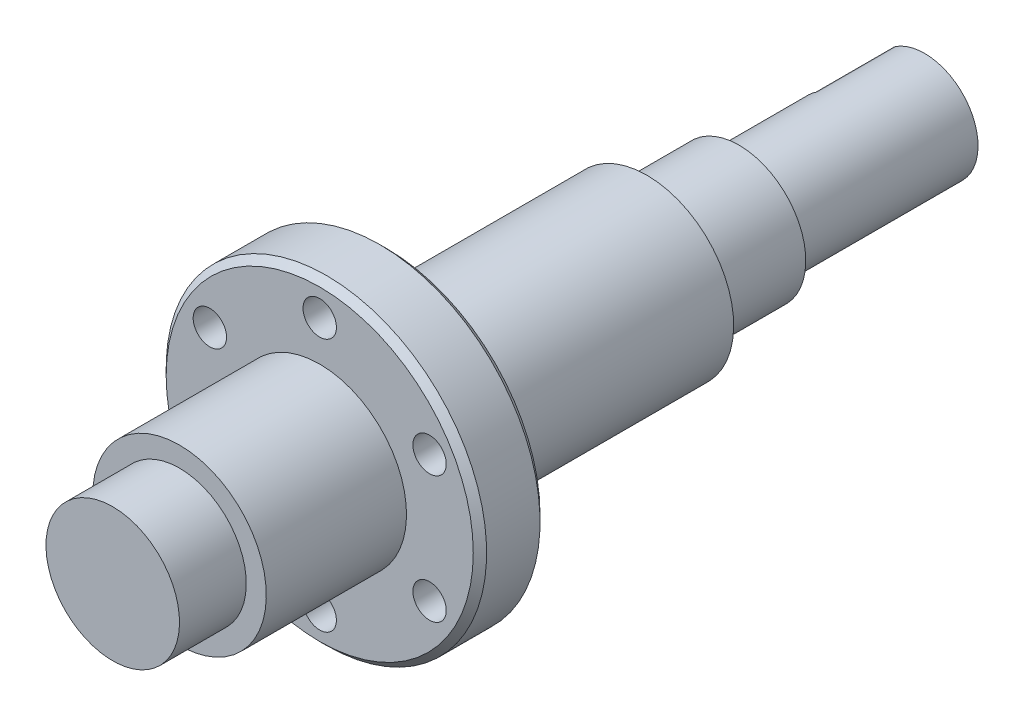
ISO-10303-21;
HEADER;
FILE_DESCRIPTION(('STEP AP214'),'2;1');
FILE_NAME('part.step','',(''),(''),'','','');
FILE_SCHEMA(('AUTOMOTIVE_DESIGN { 1 0 10303 214 1 1 1 1 }'));
ENDSEC;
DATA;
#1=APPLICATION_CONTEXT('core data for automotive mechanical design processes');
#2=APPLICATION_PROTOCOL_DEFINITION('international standard','automotive_design',2000,#1);
#3=PRODUCT_CONTEXT('',#1,'mechanical');
#4=PRODUCT('Part','Part','',(#3));
#5=PRODUCT_RELATED_PRODUCT_CATEGORY('part','',(#4));
#6=PRODUCT_DEFINITION_FORMATION('','',#4);
#7=PRODUCT_DEFINITION_CONTEXT('part definition',#1,'design');
#8=PRODUCT_DEFINITION('design','',#6,#7);
#9=PRODUCT_DEFINITION_SHAPE('','',#8);
#10=(LENGTH_UNIT() NAMED_UNIT(*) SI_UNIT(.MILLI.,.METRE.));
#11=(NAMED_UNIT(*) PLANE_ANGLE_UNIT() SI_UNIT($,.RADIAN.));
#12=(NAMED_UNIT(*) SI_UNIT($,.STERADIAN.) SOLID_ANGLE_UNIT());
#13=UNCERTAINTY_MEASURE_WITH_UNIT(LENGTH_MEASURE(1.E-05),#10,'distance_accuracy_value','');
#14=(GEOMETRIC_REPRESENTATION_CONTEXT(3) GLOBAL_UNCERTAINTY_ASSIGNED_CONTEXT((#13)) GLOBAL_UNIT_ASSIGNED_CONTEXT((#10,
#11,#12)) REPRESENTATION_CONTEXT('',''));
#15=CARTESIAN_POINT('',(0.,0.,0.));
#16=DIRECTION('',(0.,0.,1.));
#17=DIRECTION('',(1.,0.,0.));
#18=AXIS2_PLACEMENT_3D('',#15,#16,#17);
#19=CARTESIAN_POINT('',(0.,0.,-54.9));
#20=DIRECTION('',(0.,0.,-1.));
#21=DIRECTION('',(0.,1.,0.));
#22=AXIS2_PLACEMENT_3D('',#19,#20,#21);
#23=CYLINDRICAL_SURFACE('',#22,4.99999999999999);
#24=CARTESIAN_POINT('',(0.,0.,-40.));
#25=DIRECTION('',(0.,0.,-1.));
#26=DIRECTION('',(0.,1.,0.));
#27=AXIS2_PLACEMENT_3D('',#24,#25,#26);
#28=CIRCLE('',#27,4.99999999999999);
#29=CARTESIAN_POINT('',(0.,4.99999999999999,-40.));
#30=VERTEX_POINT('',#29);
#31=EDGE_CURVE('E136',#30,#30,#28,.T.);
#32=ORIENTED_EDGE('',*,*,#31,.T.);
#33=EDGE_LOOP('',(#32));
#34=FACE_BOUND('',#33,.T.);
#35=CARTESIAN_POINT('',(0.,0.,-46.9));
#36=DIRECTION('',(0.,0.,-1.));
#37=DIRECTION('',(0.,1.,0.));
#38=AXIS2_PLACEMENT_3D('',#35,#36,#37);
#39=CIRCLE('',#38,4.99999999999999);
#40=CARTESIAN_POINT('',(0.,4.99999999999999,-46.9));
#41=VERTEX_POINT('',#40);
#42=EDGE_CURVE('E110',#41,#41,#39,.F.);
#43=ORIENTED_EDGE('',*,*,#42,.T.);
#44=EDGE_LOOP('',(#43));
#45=FACE_BOUND('',#44,.T.);
#46=ADVANCED_FACE('F44',(#34,#45),#23,.T.);
#47=CARTESIAN_POINT('',(0.,0.,0.));
#48=DIRECTION('',(0.,0.,1.));
#49=DIRECTION('',(0.,-1.,0.));
#50=AXIS2_PLACEMENT_3D('',#47,#48,#49);
#51=PLANE('',#50);
#52=CARTESIAN_POINT('',(0.,0.,0.));
#53=DIRECTION('',(0.,0.,-1.));
#54=DIRECTION('',(0.,1.,0.));
#55=AXIS2_PLACEMENT_3D('',#52,#53,#54);
#56=CIRCLE('',#55,4.99999999999999);
#57=CARTESIAN_POINT('',(0.,4.99999999999999,0.));
#58=VERTEX_POINT('',#57);
#59=EDGE_CURVE('E154',#58,#58,#56,.T.);
#60=ORIENTED_EDGE('',*,*,#59,.F.);
#61=EDGE_LOOP('',(#60));
#62=FACE_BOUND('',#61,.T.);
#63=ADVANCED_FACE('F223',(#62),#51,.T.);
#64=CARTESIAN_POINT('',(0.,0.,-54.9));
#65=DIRECTION('',(0.,0.,-1.));
#66=DIRECTION('',(0.,1.,0.));
#67=AXIS2_PLACEMENT_3D('',#64,#65,#66);
#68=CYLINDRICAL_SURFACE('',#67,4.99999999999999);
#69=ORIENTED_EDGE('',*,*,#59,.T.);
#70=EDGE_LOOP('',(#69));
#71=FACE_BOUND('',#70,.T.);
#72=CARTESIAN_POINT('',(0.,0.,-5.));
#73=DIRECTION('',(0.,0.,-1.));
#74=DIRECTION('',(0.,1.,0.));
#75=AXIS2_PLACEMENT_3D('',#72,#73,#74);
#76=CIRCLE('',#75,4.99999999999999);
#77=CARTESIAN_POINT('',(0.,4.99999999999999,-5.));
#78=VERTEX_POINT('',#77);
#79=EDGE_CURVE('E151',#78,#78,#76,.T.);
#80=ORIENTED_EDGE('',*,*,#79,.F.);
#81=EDGE_LOOP('',(#80));
#82=FACE_BOUND('',#81,.T.);
#83=ADVANCED_FACE('F229',(#71,#82),#68,.T.);
#84=CARTESIAN_POINT('',(0.,4.99999999999999,-5.));
#85=DIRECTION('',(0.,0.,1.));
#86=DIRECTION('',(0.,-1.,0.));
#87=AXIS2_PLACEMENT_3D('',#84,#85,#86);
#88=PLANE('',#87);
#89=ORIENTED_EDGE('',*,*,#79,.T.);
#90=EDGE_LOOP('',(#89));
#91=FACE_BOUND('',#90,.T.);
#92=CARTESIAN_POINT('',(0.,0.,-5.));
#93=DIRECTION('',(0.,0.,-1.));
#94=DIRECTION('',(0.,1.,0.));
#95=AXIS2_PLACEMENT_3D('',#92,#93,#94);
#96=CIRCLE('',#95,6.49999999999999);
#97=CARTESIAN_POINT('',(0.,6.49999999999999,-5.));
#98=VERTEX_POINT('',#97);
#99=EDGE_CURVE('E148',#98,#98,#96,.T.);
#100=ORIENTED_EDGE('',*,*,#99,.F.);
#101=EDGE_LOOP('',(#100));
#102=FACE_BOUND('',#101,.T.);
#103=ADVANCED_FACE('F259',(#91,#102),#88,.T.);
#104=CARTESIAN_POINT('',(0.,0.,-54.9));
#105=DIRECTION('',(0.,0.,-1.));
#106=DIRECTION('',(0.,1.,0.));
#107=AXIS2_PLACEMENT_3D('',#104,#105,#106);
#108=CYLINDRICAL_SURFACE('',#107,6.49999999999999);
#109=ORIENTED_EDGE('',*,*,#99,.T.);
#110=EDGE_LOOP('',(#109));
#111=FACE_BOUND('',#110,.T.);
#112=CARTESIAN_POINT('',(0.,0.,-15.5));
#113=DIRECTION('',(0.,0.,-1.));
#114=DIRECTION('',(0.,1.,0.));
#115=AXIS2_PLACEMENT_3D('',#112,#113,#114);
#116=CIRCLE('',#115,6.49999999999999);
#117=CARTESIAN_POINT('',(0.,6.49999999999999,-15.5));
#118=VERTEX_POINT('',#117);
#119=EDGE_CURVE('E145',#118,#118,#116,.T.);
#120=ORIENTED_EDGE('',*,*,#119,.F.);
#121=EDGE_LOOP('',(#120));
#122=FACE_BOUND('',#121,.T.);
#123=ADVANCED_FACE('F255',(#111,#122),#108,.T.);
#124=CARTESIAN_POINT('',(0.,6.49999999999999,-15.5));
#125=DIRECTION('',(0.,0.,1.));
#126=DIRECTION('',(0.,-1.,0.));
#127=AXIS2_PLACEMENT_3D('',#124,#125,#126);
#128=PLANE('',#127);
#129=CARTESIAN_POINT('',(0.,0.,-15.5));
#130=DIRECTION('',(0.,0.,1.));
#131=DIRECTION('',(0.,-1.,0.));
#132=AXIS2_PLACEMENT_3D('',#129,#130,#131);
#133=CIRCLE('',#132,11.5);
#134=CARTESIAN_POINT('',(0.,-11.5,-15.5));
#135=VERTEX_POINT('',#134);
#136=EDGE_CURVE('E175',#135,#135,#133,.T.);
#137=ORIENTED_EDGE('',*,*,#136,.T.);
#138=EDGE_LOOP('',(#137));
#139=FACE_BOUND('',#138,.T.);
#140=CARTESIAN_POINT('',(-8.22724133595211,4.75000000000009,-15.5));
#141=DIRECTION('',(0.,0.,1.));
#142=DIRECTION('',(0.,-1.,0.));
#143=AXIS2_PLACEMENT_3D('',#140,#141,#142);
#144=CIRCLE('',#143,1.25);
#145=CARTESIAN_POINT('',(-8.22724133595211,3.5000000000001,-15.5));
#146=VERTEX_POINT('',#145);
#147=EDGE_CURVE('E112',#146,#146,#144,.T.);
#148=ORIENTED_EDGE('',*,*,#147,.F.);
#149=EDGE_LOOP('',(#148));
#150=FACE_BOUND('',#149,.T.);
#151=CARTESIAN_POINT('',(-8.22724133595221,-4.74999999999992,-15.5));
#152=DIRECTION('',(0.,0.,1.));
#153=DIRECTION('',(0.,-1.,0.));
#154=AXIS2_PLACEMENT_3D('',#151,#152,#153);
#155=CIRCLE('',#154,1.25);
#156=CARTESIAN_POINT('',(-8.22724133595221,-5.99999999999992,-15.5));
#157=VERTEX_POINT('',#156);
#158=EDGE_CURVE('E116',#157,#157,#155,.T.);
#159=ORIENTED_EDGE('',*,*,#158,.F.);
#160=EDGE_LOOP('',(#159));
#161=FACE_BOUND('',#160,.T.);
#162=CARTESIAN_POINT('',(0.,-9.49999999999999,-15.5));
#163=DIRECTION('',(0.,0.,1.));
#164=DIRECTION('',(0.,-1.,0.));
#165=AXIS2_PLACEMENT_3D('',#162,#163,#164);
#166=CIRCLE('',#165,1.25);
#167=CARTESIAN_POINT('',(0.,-10.75,-15.5));
#168=VERTEX_POINT('',#167);
#169=EDGE_CURVE('E120',#168,#168,#166,.T.);
#170=ORIENTED_EDGE('',*,*,#169,.F.);
#171=EDGE_LOOP('',(#170));
#172=FACE_BOUND('',#171,.T.);
#173=CARTESIAN_POINT('',(8.22724133595214,-4.75000000000003,-15.5));
#174=DIRECTION('',(0.,0.,1.));
#175=DIRECTION('',(0.,-1.,0.));
#176=AXIS2_PLACEMENT_3D('',#173,#174,#175);
#177=CIRCLE('',#176,1.25);
#178=CARTESIAN_POINT('',(8.22724133595214,-6.00000000000003,-15.5));
#179=VERTEX_POINT('',#178);
#180=EDGE_CURVE('E124',#179,#179,#177,.T.);
#181=ORIENTED_EDGE('',*,*,#180,.F.);
#182=EDGE_LOOP('',(#181));
#183=FACE_BOUND('',#182,.T.);
#184=CARTESIAN_POINT('',(8.22724133595217,4.74999999999998,-15.5));
#185=DIRECTION('',(0.,0.,1.));
#186=DIRECTION('',(0.,-1.,0.));
#187=AXIS2_PLACEMENT_3D('',#184,#185,#186);
#188=CIRCLE('',#187,1.25);
#189=CARTESIAN_POINT('',(8.22724133595217,3.49999999999998,-15.5));
#190=VERTEX_POINT('',#189);
#191=EDGE_CURVE('E128',#190,#190,#188,.T.);
#192=ORIENTED_EDGE('',*,*,#191,.F.);
#193=EDGE_LOOP('',(#192));
#194=FACE_BOUND('',#193,.T.);
#195=CARTESIAN_POINT('',(0.,9.49999999999999,-15.5));
#196=DIRECTION('',(0.,0.,1.));
#197=DIRECTION('',(1.,0.,0.));
#198=AXIS2_PLACEMENT_3D('',#195,#196,#197);
#199=CIRCLE('',#198,1.25);
#200=CARTESIAN_POINT('',(1.25,9.49999999999999,-15.5));
#201=VERTEX_POINT('',#200);
#202=EDGE_CURVE('E132',#201,#201,#199,.T.);
#203=ORIENTED_EDGE('',*,*,#202,.F.);
#204=EDGE_LOOP('',(#203));
#205=FACE_BOUND('',#204,.T.);
#206=ORIENTED_EDGE('',*,*,#119,.T.);
#207=EDGE_LOOP('',(#206));
#208=FACE_BOUND('',#207,.T.);
#209=ADVANCED_FACE('F251',(#139,#150,#161,#172,#183,#194,#205,#208),#128,.T.);
#210=CARTESIAN_POINT('',(0.,0.,-54.9));
#211=DIRECTION('',(0.,0.,-1.));
#212=DIRECTION('',(0.,1.,0.));
#213=AXIS2_PLACEMENT_3D('',#210,#211,#212);
#214=CYLINDRICAL_SURFACE('',#213,12.);
#215=CARTESIAN_POINT('',(0.,0.,-16.));
#216=DIRECTION('',(0.,0.,1.));
#217=DIRECTION('',(0.,-1.,0.));
#218=AXIS2_PLACEMENT_3D('',#215,#216,#217);
#219=CIRCLE('',#218,12.);
#220=CARTESIAN_POINT('',(0.,-12.,-16.));
#221=VERTEX_POINT('',#220);
#222=EDGE_CURVE('E172',#221,#221,#219,.F.);
#223=ORIENTED_EDGE('',*,*,#222,.T.);
#224=EDGE_LOOP('',(#223));
#225=FACE_BOUND('',#224,.T.);
#226=CARTESIAN_POINT('',(0.,0.,-20.));
#227=DIRECTION('',(0.,0.,-1.));
#228=DIRECTION('',(0.,1.,0.));
#229=AXIS2_PLACEMENT_3D('',#226,#227,#228);
#230=CIRCLE('',#229,12.);
#231=CARTESIAN_POINT('',(0.,12.,-20.));
#232=VERTEX_POINT('',#231);
#233=EDGE_CURVE('E157',#232,#232,#230,.F.);
#234=ORIENTED_EDGE('',*,*,#233,.T.);
#235=EDGE_LOOP('',(#234));
#236=FACE_BOUND('',#235,.T.);
#237=ADVANCED_FACE('F247',(#225,#236),#214,.T.);
#238=CARTESIAN_POINT('',(0.,12.,-20.5));
#239=DIRECTION('',(0.,0.,-1.));
#240=DIRECTION('',(0.,1.,0.));
#241=AXIS2_PLACEMENT_3D('',#238,#239,#240);
#242=PLANE('',#241);
#243=CARTESIAN_POINT('',(0.,0.,-20.5));
#244=DIRECTION('',(0.,0.,-1.));
#245=DIRECTION('',(0.,1.,0.));
#246=AXIS2_PLACEMENT_3D('',#243,#244,#245);
#247=CIRCLE('',#246,11.5);
#248=CARTESIAN_POINT('',(0.,11.5,-20.5));
#249=VERTEX_POINT('',#248);
#250=EDGE_CURVE('E178',#249,#249,#247,.T.);
#251=ORIENTED_EDGE('',*,*,#250,.T.);
#252=EDGE_LOOP('',(#251));
#253=FACE_BOUND('',#252,.T.);
#254=CARTESIAN_POINT('',(-8.22724133595211,4.75000000000009,-20.5));
#255=DIRECTION('',(0.,0.,-1.));
#256=DIRECTION('',(0.,1.,0.));
#257=AXIS2_PLACEMENT_3D('',#254,#255,#256);
#258=CIRCLE('',#257,1.25);
#259=CARTESIAN_POINT('',(-8.22724133595211,6.00000000000009,-20.5));
#260=VERTEX_POINT('',#259);
#261=EDGE_CURVE('E115',#260,#260,#258,.T.);
#262=ORIENTED_EDGE('',*,*,#261,.F.);
#263=EDGE_LOOP('',(#262));
#264=FACE_BOUND('',#263,.T.);
#265=CARTESIAN_POINT('',(-8.22724133595221,-4.74999999999992,-20.5));
#266=DIRECTION('',(0.,0.,-1.));
#267=DIRECTION('',(0.,1.,0.));
#268=AXIS2_PLACEMENT_3D('',#265,#266,#267);
#269=CIRCLE('',#268,1.25);
#270=CARTESIAN_POINT('',(-8.22724133595221,-3.49999999999992,-20.5));
#271=VERTEX_POINT('',#270);
#272=EDGE_CURVE('E119',#271,#271,#269,.T.);
#273=ORIENTED_EDGE('',*,*,#272,.F.);
#274=EDGE_LOOP('',(#273));
#275=FACE_BOUND('',#274,.T.);
#276=CARTESIAN_POINT('',(0.,-9.49999999999999,-20.5));
#277=DIRECTION('',(0.,0.,-1.));
#278=DIRECTION('',(0.,1.,0.));
#279=AXIS2_PLACEMENT_3D('',#276,#277,#278);
#280=CIRCLE('',#279,1.25);
#281=CARTESIAN_POINT('',(0.,-8.24999999999999,-20.5));
#282=VERTEX_POINT('',#281);
#283=EDGE_CURVE('E123',#282,#282,#280,.T.);
#284=ORIENTED_EDGE('',*,*,#283,.F.);
#285=EDGE_LOOP('',(#284));
#286=FACE_BOUND('',#285,.T.);
#287=CARTESIAN_POINT('',(8.22724133595214,-4.75000000000003,-20.5));
#288=DIRECTION('',(0.,0.,-1.));
#289=DIRECTION('',(0.,1.,0.));
#290=AXIS2_PLACEMENT_3D('',#287,#288,#289);
#291=CIRCLE('',#290,1.25);
#292=CARTESIAN_POINT('',(8.22724133595214,-3.50000000000004,-20.5));
#293=VERTEX_POINT('',#292);
#294=EDGE_CURVE('E127',#293,#293,#291,.T.);
#295=ORIENTED_EDGE('',*,*,#294,.F.);
#296=EDGE_LOOP('',(#295));
#297=FACE_BOUND('',#296,.T.);
#298=CARTESIAN_POINT('',(8.22724133595217,4.74999999999998,-20.5));
#299=DIRECTION('',(0.,0.,-1.));
#300=DIRECTION('',(0.,1.,0.));
#301=AXIS2_PLACEMENT_3D('',#298,#299,#300);
#302=CIRCLE('',#301,1.25);
#303=CARTESIAN_POINT('',(8.22724133595217,5.99999999999997,-20.5));
#304=VERTEX_POINT('',#303);
#305=EDGE_CURVE('E131',#304,#304,#302,.T.);
#306=ORIENTED_EDGE('',*,*,#305,.F.);
#307=EDGE_LOOP('',(#306));
#308=FACE_BOUND('',#307,.T.);
#309=CARTESIAN_POINT('',(0.,9.49999999999999,-20.5));
#310=DIRECTION('',(0.,0.,-1.));
#311=DIRECTION('',(0.,1.,0.));
#312=AXIS2_PLACEMENT_3D('',#309,#310,#311);
#313=CIRCLE('',#312,1.25);
#314=CARTESIAN_POINT('',(0.,10.75,-20.5));
#315=VERTEX_POINT('',#314);
#316=EDGE_CURVE('E135',#315,#315,#313,.T.);
#317=ORIENTED_EDGE('',*,*,#316,.F.);
#318=EDGE_LOOP('',(#317));
#319=FACE_BOUND('',#318,.T.);
#320=CARTESIAN_POINT('',(0.,0.,-20.5));
#321=DIRECTION('',(0.,0.,-1.));
#322=DIRECTION('',(0.,1.,0.));
#323=AXIS2_PLACEMENT_3D('',#320,#321,#322);
#324=CIRCLE('',#323,6.49999999999999);
#325=CARTESIAN_POINT('',(0.,6.49999999999999,-20.5));
#326=VERTEX_POINT('',#325);
#327=EDGE_CURVE('E142',#326,#326,#324,.T.);
#328=ORIENTED_EDGE('',*,*,#327,.F.);
#329=EDGE_LOOP('',(#328));
#330=FACE_BOUND('',#329,.T.);
#331=ADVANCED_FACE('F243',(#253,#264,#275,#286,#297,#308,#319,#330),#242,.T.);
#332=CARTESIAN_POINT('',(0.,0.,-54.9));
#333=DIRECTION('',(0.,0.,-1.));
#334=DIRECTION('',(0.,1.,0.));
#335=AXIS2_PLACEMENT_3D('',#332,#333,#334);
#336=CYLINDRICAL_SURFACE('',#335,6.49999999999999);
#337=ORIENTED_EDGE('',*,*,#327,.T.);
#338=EDGE_LOOP('',(#337));
#339=FACE_BOUND('',#338,.T.);
#340=CARTESIAN_POINT('',(0.,0.,-40.));
#341=DIRECTION('',(0.,0.,-1.));
#342=DIRECTION('',(0.,1.,0.));
#343=AXIS2_PLACEMENT_3D('',#340,#341,#342);
#344=CIRCLE('',#343,6.49999999999999);
#345=CARTESIAN_POINT('',(0.,6.49999999999999,-40.));
#346=VERTEX_POINT('',#345);
#347=EDGE_CURVE('E139',#346,#346,#344,.T.);
#348=ORIENTED_EDGE('',*,*,#347,.F.);
#349=EDGE_LOOP('',(#348));
#350=FACE_BOUND('',#349,.T.);
#351=ADVANCED_FACE('F239',(#339,#350),#336,.T.);
#352=CARTESIAN_POINT('',(0.,6.49999999999999,-40.));
#353=DIRECTION('',(0.,0.,-1.));
#354=DIRECTION('',(0.,1.,0.));
#355=AXIS2_PLACEMENT_3D('',#352,#353,#354);
#356=PLANE('',#355);
#357=ORIENTED_EDGE('',*,*,#347,.T.);
#358=EDGE_LOOP('',(#357));
#359=FACE_BOUND('',#358,.T.);
#360=ORIENTED_EDGE('',*,*,#31,.F.);
#361=EDGE_LOOP('',(#360));
#362=FACE_BOUND('',#361,.T.);
#363=ADVANCED_FACE('F235',(#359,#362),#356,.T.);
#364=CARTESIAN_POINT('',(0.,9.49999999999999,-15.5));
#365=DIRECTION('',(0.,0.,1.));
#366=DIRECTION('',(1.,0.,0.));
#367=AXIS2_PLACEMENT_3D('',#364,#365,#366);
#368=CYLINDRICAL_SURFACE('',#367,1.25);
#369=ORIENTED_EDGE('',*,*,#316,.T.);
#370=EDGE_LOOP('',(#369));
#371=FACE_BOUND('',#370,.T.);
#372=ORIENTED_EDGE('',*,*,#202,.T.);
#373=EDGE_LOOP('',(#372));
#374=FACE_BOUND('',#373,.T.);
#375=ADVANCED_FACE('F238',(#371,#374),#368,.F.);
#376=CARTESIAN_POINT('',(8.22724133595217,4.74999999999998,-15.5));
#377=DIRECTION('',(0.,0.,1.));
#378=DIRECTION('',(0.,-1.,0.));
#379=AXIS2_PLACEMENT_3D('',#376,#377,#378);
#380=CYLINDRICAL_SURFACE('',#379,1.25);
#381=ORIENTED_EDGE('',*,*,#305,.T.);
#382=EDGE_LOOP('',(#381));
#383=FACE_BOUND('',#382,.T.);
#384=ORIENTED_EDGE('',*,*,#191,.T.);
#385=EDGE_LOOP('',(#384));
#386=FACE_BOUND('',#385,.T.);
#387=ADVANCED_FACE('F400',(#383,#386),#380,.F.);
#388=CARTESIAN_POINT('',(8.22724133595214,-4.75000000000003,-15.5));
#389=DIRECTION('',(0.,0.,1.));
#390=DIRECTION('',(0.,-1.,0.));
#391=AXIS2_PLACEMENT_3D('',#388,#389,#390);
#392=CYLINDRICAL_SURFACE('',#391,1.25);
#393=ORIENTED_EDGE('',*,*,#294,.T.);
#394=EDGE_LOOP('',(#393));
#395=FACE_BOUND('',#394,.T.);
#396=ORIENTED_EDGE('',*,*,#180,.T.);
#397=EDGE_LOOP('',(#396));
#398=FACE_BOUND('',#397,.T.);
#399=ADVANCED_FACE('F392',(#395,#398),#392,.F.);
#400=CARTESIAN_POINT('',(0.,-9.49999999999999,-15.5));
#401=DIRECTION('',(0.,0.,1.));
#402=DIRECTION('',(0.,-1.,0.));
#403=AXIS2_PLACEMENT_3D('',#400,#401,#402);
#404=CYLINDRICAL_SURFACE('',#403,1.25);
#405=ORIENTED_EDGE('',*,*,#283,.T.);
#406=EDGE_LOOP('',(#405));
#407=FACE_BOUND('',#406,.T.);
#408=ORIENTED_EDGE('',*,*,#169,.T.);
#409=EDGE_LOOP('',(#408));
#410=FACE_BOUND('',#409,.T.);
#411=ADVANCED_FACE('F384',(#407,#410),#404,.F.);
#412=CARTESIAN_POINT('',(-8.22724133595221,-4.74999999999992,-15.5));
#413=DIRECTION('',(0.,0.,1.));
#414=DIRECTION('',(0.,-1.,0.));
#415=AXIS2_PLACEMENT_3D('',#412,#413,#414);
#416=CYLINDRICAL_SURFACE('',#415,1.25);
#417=ORIENTED_EDGE('',*,*,#272,.T.);
#418=EDGE_LOOP('',(#417));
#419=FACE_BOUND('',#418,.T.);
#420=ORIENTED_EDGE('',*,*,#158,.T.);
#421=EDGE_LOOP('',(#420));
#422=FACE_BOUND('',#421,.T.);
#423=ADVANCED_FACE('F375',(#419,#422),#416,.F.);
#424=CARTESIAN_POINT('',(-8.22724133595211,4.75000000000009,-15.5));
#425=DIRECTION('',(0.,0.,1.));
#426=DIRECTION('',(0.,-1.,0.));
#427=AXIS2_PLACEMENT_3D('',#424,#425,#426);
#428=CYLINDRICAL_SURFACE('',#427,1.25);
#429=ORIENTED_EDGE('',*,*,#261,.T.);
#430=EDGE_LOOP('',(#429));
#431=FACE_BOUND('',#430,.T.);
#432=ORIENTED_EDGE('',*,*,#147,.T.);
#433=EDGE_LOOP('',(#432));
#434=FACE_BOUND('',#433,.T.);
#435=ADVANCED_FACE('F275',(#431,#434),#428,.F.);
#436=CARTESIAN_POINT('',(0.,0.,-16.));
#437=DIRECTION('',(0.,0.,-1.));
#438=DIRECTION('',(0.,1.,0.));
#439=AXIS2_PLACEMENT_3D('',#436,#437,#438);
#440=CONICAL_SURFACE('',#439,12.,0.785398163397448);
#441=ORIENTED_EDGE('',*,*,#136,.F.);
#442=EDGE_LOOP('',(#441));
#443=FACE_BOUND('',#442,.T.);
#444=ORIENTED_EDGE('',*,*,#222,.F.);
#445=EDGE_LOOP('',(#444));
#446=FACE_BOUND('',#445,.T.);
#447=ADVANCED_FACE('F268',(#443,#446),#440,.T.);
#448=CARTESIAN_POINT('',(0.,0.,-20.5));
#449=DIRECTION('',(0.,0.,1.));
#450=DIRECTION('',(0.,-1.,0.));
#451=AXIS2_PLACEMENT_3D('',#448,#449,#450);
#452=CONICAL_SURFACE('',#451,11.5,0.785398163397438);
#453=ORIENTED_EDGE('',*,*,#233,.F.);
#454=EDGE_LOOP('',(#453));
#455=FACE_BOUND('',#454,.T.);
#456=ORIENTED_EDGE('',*,*,#250,.F.);
#457=EDGE_LOOP('',(#456));
#458=FACE_BOUND('',#457,.T.);
#459=ADVANCED_FACE('F274',(#455,#458),#452,.T.);
#460=CARTESIAN_POINT('',(0.,0.,-46.9));
#461=DIRECTION('',(0.,0.,-1.));
#462=DIRECTION('',(0.,1.,0.));
#463=AXIS2_PLACEMENT_3D('',#460,#461,#462);
#464=PLANE('',#463);
#465=ORIENTED_EDGE('',*,*,#42,.F.);
#466=EDGE_LOOP('',(#465));
#467=FACE_BOUND('',#466,.T.);
#468=CARTESIAN_POINT('',(0.,0.,-46.9));
#469=DIRECTION('',(0.,0.,-1.));
#470=DIRECTION('',(0.,1.,0.));
#471=AXIS2_PLACEMENT_3D('',#468,#469,#470);
#472=CIRCLE('',#471,4.);
#473=CARTESIAN_POINT('',(0.,4.00000000000001,-46.9));
#474=VERTEX_POINT('',#473);
#475=EDGE_CURVE('E107',#474,#474,#472,.T.);
#476=ORIENTED_EDGE('',*,*,#475,.F.);
#477=EDGE_LOOP('',(#476));
#478=FACE_BOUND('',#477,.T.);
#479=ADVANCED_FACE('F280',(#467,#478),#464,.T.);
#480=CARTESIAN_POINT('',(0.,0.,-46.9));
#481=DIRECTION('',(0.,0.,-1.));
#482=DIRECTION('',(0.,1.,0.));
#483=AXIS2_PLACEMENT_3D('',#480,#481,#482);
#484=CYLINDRICAL_SURFACE('',#483,4.);
#485=ORIENTED_EDGE('',*,*,#475,.T.);
#486=EDGE_LOOP('',(#485));
#487=FACE_BOUND('',#486,.T.);
#488=CARTESIAN_POINT('',(0.,0.,-54.9));
#489=DIRECTION('',(0.,0.,-1.));
#490=DIRECTION('',(0.,1.,0.));
#491=AXIS2_PLACEMENT_3D('',#488,#489,#490);
#492=CIRCLE('',#491,4.);
#493=CARTESIAN_POINT('',(-2.13333333333333,-3.3836206774532,-54.9));
#494=VERTEX_POINT('',#493);
#495=CARTESIAN_POINT('',(-2.13333333333333,3.38362067745321,-54.9));
#496=VERTEX_POINT('',#495);
#497=EDGE_CURVE('E59',#494,#496,#492,.T.);
#498=ORIENTED_EDGE('',*,*,#497,.F.);
#499=DIRECTION('',(0.,0.,-1.));
#500=VECTOR('',#499,1.);
#501=CARTESIAN_POINT('',(-2.13333333333333,-3.3836206774532,-46.9));
#502=LINE('',#501,#500);
#503=CARTESIAN_POINT('',(-2.13333333333333,-3.3836206774532,-60.8));
#504=VERTEX_POINT('',#503);
#505=EDGE_CURVE('E190',#494,#504,#502,.T.);
#506=ORIENTED_EDGE('',*,*,#505,.T.);
#507=CARTESIAN_POINT('',(0.,0.,-60.8));
#508=DIRECTION('',(0.,0.,-1.));
#509=DIRECTION('',(0.,1.,0.));
#510=AXIS2_PLACEMENT_3D('',#507,#508,#509);
#511=CIRCLE('',#510,4.);
#512=CARTESIAN_POINT('',(-2.13333333333333,3.38362067745321,-60.8));
#513=VERTEX_POINT('',#512);
#514=EDGE_CURVE('E97',#513,#504,#511,.T.);
#515=ORIENTED_EDGE('',*,*,#514,.F.);
#516=DIRECTION('',(0.,0.,-1.));
#517=VECTOR('',#516,1.);
#518=CARTESIAN_POINT('',(-2.13333333333333,3.38362067745321,-46.9));
#519=LINE('',#518,#517);
#520=EDGE_CURVE('E188',#513,#496,#519,.F.);
#521=ORIENTED_EDGE('',*,*,#520,.T.);
#522=EDGE_LOOP('',(#498,#506,#515,#521));
#523=FACE_BOUND('',#522,.T.);
#524=ADVANCED_FACE('F203',(#487,#523),#484,.T.);
#525=CARTESIAN_POINT('',(0.,4.99999999999999,-54.9));
#526=DIRECTION('',(0.,0.,-1.));
#527=DIRECTION('',(0.,1.,0.));
#528=AXIS2_PLACEMENT_3D('',#525,#526,#527);
#529=PLANE('',#528);
#530=DIRECTION('',(0.,1.,0.));
#531=VECTOR('',#530,1.);
#532=CARTESIAN_POINT('',(-2.6,3.03973683071414,-54.9));
#533=LINE('',#532,#531);
#534=CARTESIAN_POINT('',(-2.6,-2.5377155080899,-54.9));
#535=VERTEX_POINT('',#534);
#536=CARTESIAN_POINT('',(-2.6,2.53771550808991,-54.9));
#537=VERTEX_POINT('',#536);
#538=EDGE_CURVE('E93',#535,#537,#533,.T.);
#539=ORIENTED_EDGE('',*,*,#538,.F.);
#540=CARTESIAN_POINT('',(-1.6,-2.5377155080899,-54.9));
#541=DIRECTION('',(0.,0.,-1.));
#542=DIRECTION('',(0.,1.,0.));
#543=AXIS2_PLACEMENT_3D('',#540,#541,#542);
#544=CIRCLE('',#543,1.);
#545=EDGE_CURVE('E52',#535,#494,#544,.F.);
#546=ORIENTED_EDGE('',*,*,#545,.T.);
#547=ORIENTED_EDGE('',*,*,#497,.T.);
#548=CARTESIAN_POINT('',(-1.6,2.53771550808991,-54.9));
#549=DIRECTION('',(0.,0.,-1.));
#550=DIRECTION('',(0.,1.,0.));
#551=AXIS2_PLACEMENT_3D('',#548,#549,#550);
#552=CIRCLE('',#551,1.);
#553=EDGE_CURVE('E12',#496,#537,#552,.F.);
#554=ORIENTED_EDGE('',*,*,#553,.T.);
#555=EDGE_LOOP('',(#539,#546,#547,#554));
#556=FACE_BOUND('',#555,.T.);
#557=ADVANCED_FACE('F197',(#556),#529,.T.);
#558=CARTESIAN_POINT('',(-2.6,3.03973683071414,-60.8));
#559=DIRECTION('',(1.,0.,0.));
#560=DIRECTION('',(0.,0.,-1.));
#561=AXIS2_PLACEMENT_3D('',#558,#559,#560);
#562=PLANE('',#561);
#563=DIRECTION('',(0.,1.,0.));
#564=VECTOR('',#563,1.);
#565=CARTESIAN_POINT('',(-2.6,3.03973683071414,-60.8));
#566=LINE('',#565,#564);
#567=CARTESIAN_POINT('',(-2.6,-2.5377155080899,-60.8));
#568=VERTEX_POINT('',#567);
#569=CARTESIAN_POINT('',(-2.6,2.53771550808991,-60.8));
#570=VERTEX_POINT('',#569);
#571=EDGE_CURVE('E104',#568,#570,#566,.T.);
#572=ORIENTED_EDGE('',*,*,#571,.F.);
#573=DIRECTION('',(0.,0.,1.));
#574=VECTOR('',#573,1.);
#575=CARTESIAN_POINT('',(-2.6,-2.5377155080899,-54.9));
#576=LINE('',#575,#574);
#577=EDGE_CURVE('E185',#568,#535,#576,.T.);
#578=ORIENTED_EDGE('',*,*,#577,.T.);
#579=ORIENTED_EDGE('',*,*,#538,.T.);
#580=DIRECTION('',(0.,0.,1.));
#581=VECTOR('',#580,1.);
#582=CARTESIAN_POINT('',(-2.6,2.53771550808991,-60.8));
#583=LINE('',#582,#581);
#584=EDGE_CURVE('E181',#537,#570,#583,.F.);
#585=ORIENTED_EDGE('',*,*,#584,.T.);
#586=EDGE_LOOP('',(#572,#578,#579,#585));
#587=FACE_BOUND('',#586,.T.);
#588=ADVANCED_FACE('F211',(#587),#562,.F.);
#589=CARTESIAN_POINT('',(0.,0.,-60.8));
#590=DIRECTION('',(0.,0.,-1.));
#591=DIRECTION('',(0.,1.,0.));
#592=AXIS2_PLACEMENT_3D('',#589,#590,#591);
#593=PLANE('',#592);
#594=CARTESIAN_POINT('',(0.,0.,-60.8));
#595=DIRECTION('',(0.,0.,-1.));
#596=DIRECTION('',(0.,1.,0.));
#597=AXIS2_PLACEMENT_3D('',#594,#595,#596);
#598=CIRCLE('',#597,1.24999999999999);
#599=CARTESIAN_POINT('',(0.,1.25,-60.8));
#600=VERTEX_POINT('',#599);
#601=EDGE_CURVE('E94',#600,#600,#598,.T.);
#602=ORIENTED_EDGE('',*,*,#601,.F.);
#603=EDGE_LOOP('',(#602));
#604=FACE_BOUND('',#603,.T.);
#605=ORIENTED_EDGE('',*,*,#514,.T.);
#606=CARTESIAN_POINT('',(-1.6,-2.5377155080899,-60.8));
#607=DIRECTION('',(0.,0.,-1.));
#608=DIRECTION('',(0.,1.,0.));
#609=AXIS2_PLACEMENT_3D('',#606,#607,#608);
#610=CIRCLE('',#609,1.);
#611=EDGE_CURVE('E194',#504,#568,#610,.T.);
#612=ORIENTED_EDGE('',*,*,#611,.T.);
#613=ORIENTED_EDGE('',*,*,#571,.T.);
#614=CARTESIAN_POINT('',(-1.6,2.53771550808991,-60.8));
#615=DIRECTION('',(0.,0.,-1.));
#616=DIRECTION('',(0.,1.,0.));
#617=AXIS2_PLACEMENT_3D('',#614,#615,#616);
#618=CIRCLE('',#617,1.);
#619=EDGE_CURVE('E192',#570,#513,#618,.T.);
#620=ORIENTED_EDGE('',*,*,#619,.T.);
#621=EDGE_LOOP('',(#605,#612,#613,#620));
#622=FACE_BOUND('',#621,.T.);
#623=ADVANCED_FACE('F87',(#604,#622),#593,.T.);
#624=CARTESIAN_POINT('',(0.,0.,-53.3));
#625=DIRECTION('',(0.,0.,-1.));
#626=DIRECTION('',(0.,1.,0.));
#627=AXIS2_PLACEMENT_3D('',#624,#625,#626);
#628=CONICAL_SURFACE('',#627,1.24999999999999,1.02974425867665);
#629=CARTESIAN_POINT('',(0.,0.,-52.5489242262156));
#630=VERTEX_POINT('',#629);
#631=VERTEX_LOOP('',#630);
#632=FACE_BOUND('',#631,.T.);
#633=CARTESIAN_POINT('',(0.,0.,-53.3));
#634=DIRECTION('',(0.,0.,-1.));
#635=DIRECTION('',(0.,1.,0.));
#636=AXIS2_PLACEMENT_3D('',#633,#634,#635);
#637=CIRCLE('',#636,1.24999999999999);
#638=CARTESIAN_POINT('',(0.,1.24999999999999,-53.3));
#639=VERTEX_POINT('',#638);
#640=EDGE_CURVE('E91',#639,#639,#637,.T.);
#641=ORIENTED_EDGE('',*,*,#640,.T.);
#642=EDGE_LOOP('',(#641));
#643=FACE_BOUND('',#642,.T.);
#644=ADVANCED_FACE('F83',(#632,#643),#628,.F.);
#645=CARTESIAN_POINT('',(0.,0.,-60.8));
#646=DIRECTION('',(0.,0.,-1.));
#647=DIRECTION('',(0.,1.,0.));
#648=AXIS2_PLACEMENT_3D('',#645,#646,#647);
#649=CYLINDRICAL_SURFACE('',#648,1.24999999999999);
#650=ORIENTED_EDGE('',*,*,#640,.F.);
#651=EDGE_LOOP('',(#650));
#652=FACE_BOUND('',#651,.T.);
#653=ORIENTED_EDGE('',*,*,#601,.T.);
#654=EDGE_LOOP('',(#653));
#655=FACE_BOUND('',#654,.T.);
#656=ADVANCED_FACE('F86',(#652,#655),#649,.F.);
#657=CARTESIAN_POINT('',(-1.6,-2.5377155080899,-46.9));
#658=DIRECTION('',(0.,0.,-1.));
#659=DIRECTION('',(0.,1.,0.));
#660=AXIS2_PLACEMENT_3D('',#657,#658,#659);
#661=CYLINDRICAL_SURFACE('',#660,1.);
#662=ORIENTED_EDGE('',*,*,#611,.F.);
#663=ORIENTED_EDGE('',*,*,#505,.F.);
#664=ORIENTED_EDGE('',*,*,#545,.F.);
#665=ORIENTED_EDGE('',*,*,#577,.F.);
#666=EDGE_LOOP('',(#662,#663,#664,#665));
#667=FACE_BOUND('',#666,.T.);
#668=ADVANCED_FACE('F201',(#667),#661,.T.);
#669=CARTESIAN_POINT('',(-1.6,2.53771550808991,-46.9));
#670=DIRECTION('',(0.,0.,-1.));
#671=DIRECTION('',(0.,1.,0.));
#672=AXIS2_PLACEMENT_3D('',#669,#670,#671);
#673=CYLINDRICAL_SURFACE('',#672,1.);
#674=ORIENTED_EDGE('',*,*,#619,.F.);
#675=ORIENTED_EDGE('',*,*,#584,.F.);
#676=ORIENTED_EDGE('',*,*,#553,.F.);
#677=ORIENTED_EDGE('',*,*,#520,.F.);
#678=EDGE_LOOP('',(#674,#675,#676,#677));
#679=FACE_BOUND('',#678,.T.);
#680=ADVANCED_FACE('F46',(#679),#673,.T.);
#681=CLOSED_SHELL('',(#46,#63,#83,#103,#123,#209,#237,#331,#351,#363,#375,#387,#399,#411,#423,
#435,#447,#459,#479,#524,#557,#588,#623,#644,#656,#668,#680));
#682=MANIFOLD_SOLID_BREP('B2',#681);
#683=ADVANCED_BREP_SHAPE_REPRESENTATION('',(#18,#682),#14);
#684=SHAPE_DEFINITION_REPRESENTATION(#9,#683);
ENDSEC;
END-ISO-10303-21;
